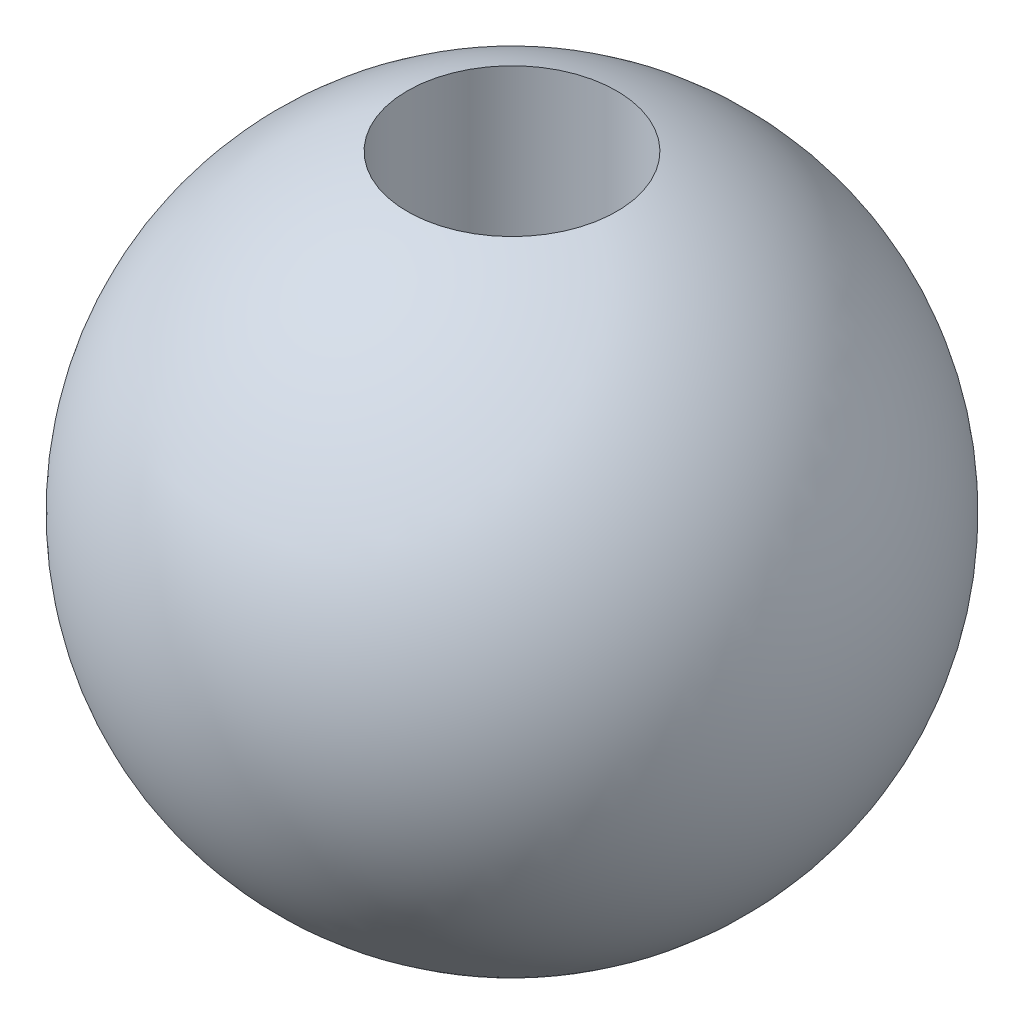
ISO-10303-21;
HEADER;
FILE_DESCRIPTION(('STEP AP214'),'2;1');
FILE_NAME('part.step','',(''),(''),'','','');
FILE_SCHEMA(('AUTOMOTIVE_DESIGN { 1 0 10303 214 1 1 1 1 }'));
ENDSEC;
DATA;
#1=APPLICATION_CONTEXT('core data for automotive mechanical design processes');
#2=APPLICATION_PROTOCOL_DEFINITION('international standard','automotive_design',2000,#1);
#3=PRODUCT_CONTEXT('',#1,'mechanical');
#4=PRODUCT('Part','Part','',(#3));
#5=PRODUCT_RELATED_PRODUCT_CATEGORY('part','',(#4));
#6=PRODUCT_DEFINITION_FORMATION('','',#4);
#7=PRODUCT_DEFINITION_CONTEXT('part definition',#1,'design');
#8=PRODUCT_DEFINITION('design','',#6,#7);
#9=PRODUCT_DEFINITION_SHAPE('','',#8);
#10=(LENGTH_UNIT() NAMED_UNIT(*) SI_UNIT(.MILLI.,.METRE.));
#11=(NAMED_UNIT(*) PLANE_ANGLE_UNIT() SI_UNIT($,.RADIAN.));
#12=(NAMED_UNIT(*) SI_UNIT($,.STERADIAN.) SOLID_ANGLE_UNIT());
#13=UNCERTAINTY_MEASURE_WITH_UNIT(LENGTH_MEASURE(1.E-05),#10,'distance_accuracy_value','');
#14=(GEOMETRIC_REPRESENTATION_CONTEXT(3) GLOBAL_UNCERTAINTY_ASSIGNED_CONTEXT((#13)) GLOBAL_UNIT_ASSIGNED_CONTEXT((#10,
#11,#12)) REPRESENTATION_CONTEXT('',''));
#15=CARTESIAN_POINT('',(0.,0.,0.));
#16=DIRECTION('',(0.,0.,1.));
#17=DIRECTION('',(1.,0.,0.));
#18=AXIS2_PLACEMENT_3D('',#15,#16,#17);
#19=CARTESIAN_POINT('',(0.,0.,0.));
#20=DIRECTION('',(0.,-1.,0.));
#21=DIRECTION('',(-1.,0.,0.));
#22=AXIS2_PLACEMENT_3D('',#19,#20,#21);
#23=SPHERICAL_SURFACE('',#22,1.2);
#24=CARTESIAN_POINT('',(0.,-1.13790992613651,0.));
#25=DIRECTION('',(0.,-1.,0.));
#26=DIRECTION('',(0.,0.,-1.));
#27=AXIS2_PLACEMENT_3D('',#24,#25,#26);
#28=CIRCLE('',#27,0.381);
#29=CARTESIAN_POINT('',(-0.381,-1.13790992613651,0.));
#30=VERTEX_POINT('',#29);
#31=EDGE_CURVE('E10',#30,#30,#28,.T.);
#32=CARTESIAN_POINT('',(0.,1.13790992613651,0.));
#33=DIRECTION('',(0.,-1.,0.));
#34=DIRECTION('',(0.,0.,-1.));
#35=AXIS2_PLACEMENT_3D('',#32,#33,#34);
#36=CIRCLE('',#35,0.381);
#37=CARTESIAN_POINT('',(-0.380999999999999,1.13790992613651,0.));
#38=VERTEX_POINT('',#37);
#39=EDGE_CURVE('E36',#38,#38,#36,.T.);
#40=CARTESIAN_POINT('',(-0.381,-1.13790992613651,0.));
#41=CARTESIAN_POINT('',(-0.410579681769356,-1.12800871959247,0.));
#42=CARTESIAN_POINT('',(-0.439771220775093,-1.1169493990154,0.));
#43=CARTESIAN_POINT('',(-0.497205135898063,-1.09259247816989,0.));
#44=CARTESIAN_POINT('',(-0.525447512015295,-1.07929487790147,0.));
#45=CARTESIAN_POINT('',(-0.580810223999993,-1.05053934604798,0.));
#46=CARTESIAN_POINT('',(-0.607930559867459,-1.03508141446291,0.));
#47=CARTESIAN_POINT('',(-0.660884679605577,-1.00209994419934,0.));
#48=CARTESIAN_POINT('',(-0.686718463476229,-0.984576405520842,0.));
#49=CARTESIAN_POINT('',(-0.736942372985843,-0.947570023382544,0.));
#50=CARTESIAN_POINT('',(-0.761332498624805,-0.928087179922746,0.));
#51=CARTESIAN_POINT('',(-0.808520871029153,-0.88728066098061,0.));
#52=CARTESIAN_POINT('',(-0.831319117794539,-0.865956985498271,0.));
#53=CARTESIAN_POINT('',(-0.87518515757102,-0.821598393788307,0.));
#54=CARTESIAN_POINT('',(-0.896252950582115,-0.798563477560681,0.));
#55=CARTESIAN_POINT('',(-0.936530033700233,-0.750922415413206,0.));
#56=CARTESIAN_POINT('',(-0.955739323807257,-0.726316269493356,0.));
#57=CARTESIAN_POINT('',(-0.992182645882494,-0.675682303972394,0.));
#58=CARTESIAN_POINT('',(-1.00941667785071,-0.649654484371283,0.));
#59=CARTESIAN_POINT('',(-1.04180473467851,-0.596335369833659,0.));
#60=CARTESIAN_POINT('',(-1.0569587595381,-0.569044074897146,0.));
#61=CARTESIAN_POINT('',(-1.08509469538652,-0.513363887123419,0.));
#62=CARTESIAN_POINT('',(-1.09807660637536,-0.484974994286205,0.));
#63=CARTESIAN_POINT('',(-1.12178940995055,-0.427272159483719,0.));
#64=CARTESIAN_POINT('',(-1.13252030253691,-0.397958217518448,0.));
#65=CARTESIAN_POINT('',(-1.15166584653844,-0.338583455689727,0.));
#66=CARTESIAN_POINT('',(-1.16008049795361,-0.308522635826277,0.));
#67=CARTESIAN_POINT('',(-1.17454241504744,-0.247836828989825,0.));
#68=CARTESIAN_POINT('',(-1.18058968072611,-0.217211842016822,0.));
#69=CARTESIAN_POINT('',(-1.19028007083985,-0.155583840776814,0.));
#70=CARTESIAN_POINT('',(-1.19392319527493,-0.124580826509808,0.));
#71=CARTESIAN_POINT('',(-1.198783159855,-0.0623852081618682,0.));
#72=CARTESIAN_POINT('',(-1.2,-0.031192604080934,0.));
#73=CARTESIAN_POINT('',(-1.2,0.0311926040809345,0.));
#74=CARTESIAN_POINT('',(-1.198783159855,0.0623852081618687,0.));
#75=CARTESIAN_POINT('',(-1.19392319527493,0.124580826509809,0.));
#76=CARTESIAN_POINT('',(-1.19028007083985,0.155583840776814,0.));
#77=CARTESIAN_POINT('',(-1.18058968072611,0.217211842016823,0.));
#78=CARTESIAN_POINT('',(-1.17454241504744,0.247836828989825,0.));
#79=CARTESIAN_POINT('',(-1.16008049795361,0.308522635826278,0.));
#80=CARTESIAN_POINT('',(-1.15166584653844,0.338583455689727,0.));
#81=CARTESIAN_POINT('',(-1.13252030253691,0.397958217518449,0.));
#82=CARTESIAN_POINT('',(-1.12178940995055,0.42727215948372,0.));
#83=CARTESIAN_POINT('',(-1.09807660637536,0.484974994286205,0.));
#84=CARTESIAN_POINT('',(-1.08509469538652,0.513363887123419,0.));
#85=CARTESIAN_POINT('',(-1.0569587595381,0.569044074897146,0.));
#86=CARTESIAN_POINT('',(-1.04180473467851,0.596335369833659,0.));
#87=CARTESIAN_POINT('',(-1.00941667785071,0.649654484371283,0.));
#88=CARTESIAN_POINT('',(-0.992182645882493,0.675682303972395,0.));
#89=CARTESIAN_POINT('',(-0.955739323807257,0.726316269493356,0.));
#90=CARTESIAN_POINT('',(-0.936530033700233,0.750922415413206,0.));
#91=CARTESIAN_POINT('',(-0.896252950582115,0.798563477560682,0.));
#92=CARTESIAN_POINT('',(-0.87518515757102,0.821598393788307,0.));
#93=CARTESIAN_POINT('',(-0.831319117794539,0.865956985498271,0.));
#94=CARTESIAN_POINT('',(-0.808520871029152,0.88728066098061,0.));
#95=CARTESIAN_POINT('',(-0.761332498624805,0.928087179922747,0.));
#96=CARTESIAN_POINT('',(-0.736942372985843,0.947570023382544,0.));
#97=CARTESIAN_POINT('',(-0.686718463476229,0.984576405520843,0.));
#98=CARTESIAN_POINT('',(-0.660884679605576,1.00209994419934,0.));
#99=CARTESIAN_POINT('',(-0.607930559867458,1.03508141446291,0.));
#100=CARTESIAN_POINT('',(-0.580810223999993,1.05053934604798,0.));
#101=CARTESIAN_POINT('',(-0.525447512015295,1.07929487790147,0.));
#102=CARTESIAN_POINT('',(-0.497205135898062,1.09259247816989,0.));
#103=CARTESIAN_POINT('',(-0.439771220775092,1.1169493990154,0.));
#104=CARTESIAN_POINT('',(-0.410579681769356,1.12800871959247,0.));
#105=CARTESIAN_POINT('',(-0.380999999999999,1.13790992613651,0.));
#106=B_SPLINE_CURVE_WITH_KNOTS('',3,(#40,#41,#42,#43,#44,#45,#46,#47,#48,#49,#50,#51,#52,#53,
#54,#55,#56,#57,#58,#59,#60,#61,#62,#63,#64,#65,#66,#67,#68,#69,#70,#71,#72,#73,#74,#75,#76,#77,
#78,#79,#80,#81,#82,#83,#84,#85,#86,#87,#88,#89,#90,#91,#92,#93,#94,#95,#96,#97,#98,#99,#100,
#101,#102,#103,#104,#105),.UNSPECIFIED.,.F.,.F.,(4,2,2,2,2,2,2,2,2,2,2,2,2,2,2,2,2,2,2,2,2,2,2,
2,2,2,2,2,2,2,2,2,4),(0.,0.0935541225392304,0.187108245078461,0.280662367617691,
0.374216490156922,0.467770612696152,0.561324735235382,0.654878857774613,0.748432980313843,
0.841987102853074,0.935541225392304,1.02909534793153,1.12264947047077,1.21620359301,
1.30975771554923,1.40331183808846,1.49686596062769,1.59042008316692,1.68397420570615,
1.77752832824538,1.87108245078461,1.96463657332384,2.05819069586307,2.1517448184023,
2.24529894094153,2.33885306348076,2.43240718601999,2.52596130855922,2.61951543109845,
2.71306955363768,2.80662367617691,2.90017779871614,2.99373192125537),.UNSPECIFIED.);
#107=EDGE_CURVE('BSEAM30',#30,#38,#106,.T.);
#108=ORIENTED_EDGE('',*,*,#31,.F.);
#109=ORIENTED_EDGE('',*,*,#39,.T.);
#110=ORIENTED_EDGE('',*,*,#107,.T.);
#111=ORIENTED_EDGE('',*,*,#107,.F.);
#112=EDGE_LOOP('',(#108,#110,#109,#111));
#113=FACE_BOUND('',#112,.T.);
#114=ADVANCED_FACE('F30',(#113),#23,.T.);
#115=CARTESIAN_POINT('',(0.,0.,0.));
#116=DIRECTION('',(0.,-1.,0.));
#117=DIRECTION('',(0.,0.,-1.));
#118=AXIS2_PLACEMENT_3D('',#115,#116,#117);
#119=CYLINDRICAL_SURFACE('',#118,0.381);
#120=ORIENTED_EDGE('',*,*,#39,.F.);
#121=EDGE_LOOP('',(#120));
#122=FACE_BOUND('',#121,.T.);
#123=ORIENTED_EDGE('',*,*,#31,.T.);
#124=EDGE_LOOP('',(#123));
#125=FACE_BOUND('',#124,.T.);
#126=ADVANCED_FACE('F43',(#122,#125),#119,.F.);
#127=CLOSED_SHELL('',(#114,#126));
#128=MANIFOLD_SOLID_BREP('B2',#127);
#129=ADVANCED_BREP_SHAPE_REPRESENTATION('',(#18,#128),#14);
#130=SHAPE_DEFINITION_REPRESENTATION(#9,#129);
ENDSEC;
END-ISO-10303-21;
